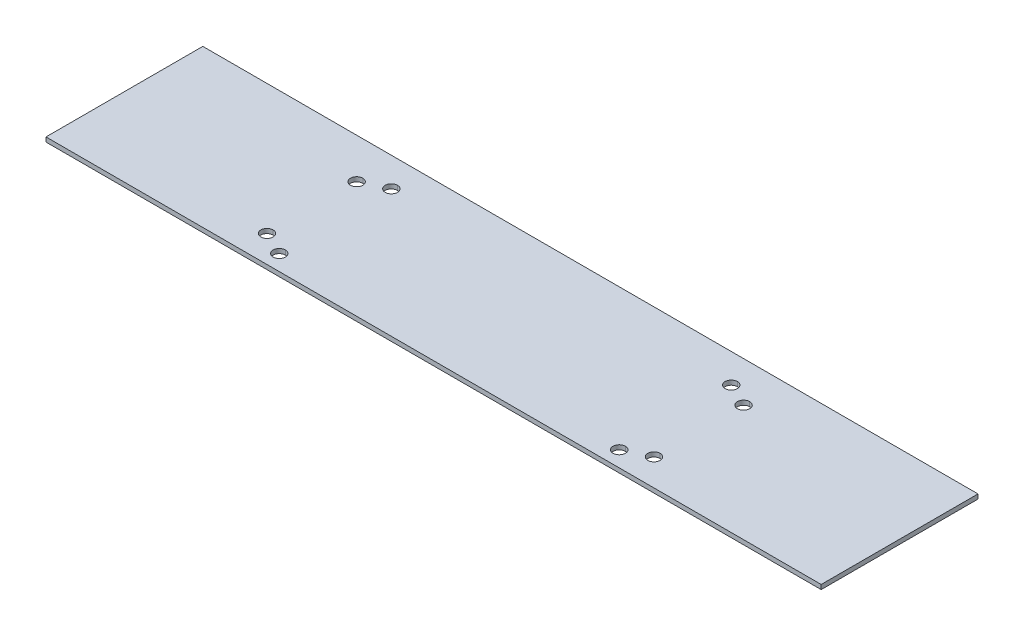
ISO-10303-21;
HEADER;
FILE_DESCRIPTION(('STEP AP214'),'2;1');
FILE_NAME('part.step','',(''),(''),'','','');
FILE_SCHEMA(('AUTOMOTIVE_DESIGN { 1 0 10303 214 1 1 1 1 }'));
ENDSEC;
DATA;
#1=APPLICATION_CONTEXT('core data for automotive mechanical design processes');
#2=APPLICATION_PROTOCOL_DEFINITION('international standard','automotive_design',2000,#1);
#3=PRODUCT_CONTEXT('',#1,'mechanical');
#4=PRODUCT('Part','Part','',(#3));
#5=PRODUCT_RELATED_PRODUCT_CATEGORY('part','',(#4));
#6=PRODUCT_DEFINITION_FORMATION('','',#4);
#7=PRODUCT_DEFINITION_CONTEXT('part definition',#1,'design');
#8=PRODUCT_DEFINITION('design','',#6,#7);
#9=PRODUCT_DEFINITION_SHAPE('','',#8);
#10=(LENGTH_UNIT() NAMED_UNIT(*) SI_UNIT(.MILLI.,.METRE.));
#11=(NAMED_UNIT(*) PLANE_ANGLE_UNIT() SI_UNIT($,.RADIAN.));
#12=(NAMED_UNIT(*) SI_UNIT($,.STERADIAN.) SOLID_ANGLE_UNIT());
#13=UNCERTAINTY_MEASURE_WITH_UNIT(LENGTH_MEASURE(1.E-05),#10,'distance_accuracy_value','');
#14=(GEOMETRIC_REPRESENTATION_CONTEXT(3) GLOBAL_UNCERTAINTY_ASSIGNED_CONTEXT((#13)) GLOBAL_UNIT_ASSIGNED_CONTEXT((#10,
#11,#12)) REPRESENTATION_CONTEXT('',''));
#15=CARTESIAN_POINT('',(0.,0.,0.));
#16=DIRECTION('',(0.,0.,1.));
#17=DIRECTION('',(1.,0.,0.));
#18=AXIS2_PLACEMENT_3D('',#15,#16,#17);
#19=CARTESIAN_POINT('',(-86.36,1.00000000000001,18.));
#20=DIRECTION('',(0.,1.,0.));
#21=DIRECTION('',(0.,0.,1.));
#22=AXIS2_PLACEMENT_3D('',#19,#20,#21);
#23=CYLINDRICAL_SURFACE('',#22,2.75);
#24=CARTESIAN_POINT('',(-86.36,-1.00000000000003,18.));
#25=DIRECTION('',(0.,1.,0.));
#26=DIRECTION('',(0.,0.,1.));
#27=AXIS2_PLACEMENT_3D('',#24,#25,#26);
#28=CIRCLE('',#27,2.75);
#29=CARTESIAN_POINT('',(-86.36,-1.00000000000003,15.25));
#30=VERTEX_POINT('',#29);
#31=CARTESIAN_POINT('',(-86.36,-1.00000000000003,20.75));
#32=VERTEX_POINT('',#31);
#33=EDGE_CURVE('E41',#30,#32,#28,.T.);
#34=ORIENTED_EDGE('',*,*,#33,.F.);
#35=DIRECTION('',(0.,1.,0.));
#36=VECTOR('',#35,1.);
#37=CARTESIAN_POINT('',(-86.36,1.00000000000001,15.25));
#38=LINE('',#37,#36);
#39=CARTESIAN_POINT('',(-86.36,1.00000000000001,15.25));
#40=VERTEX_POINT('',#39);
#41=EDGE_CURVE('E11',#30,#40,#38,.T.);
#42=ORIENTED_EDGE('',*,*,#41,.T.);
#43=CARTESIAN_POINT('',(-86.36,1.00000000000001,18.));
#44=DIRECTION('',(0.,1.,0.));
#45=DIRECTION('',(0.,0.,1.));
#46=AXIS2_PLACEMENT_3D('',#43,#44,#45);
#47=CIRCLE('',#46,2.75);
#48=CARTESIAN_POINT('',(-86.36,1.00000000000001,20.75));
#49=VERTEX_POINT('',#48);
#50=EDGE_CURVE('E27',#40,#49,#47,.T.);
#51=ORIENTED_EDGE('',*,*,#50,.T.);
#52=DIRECTION('',(0.,1.,0.));
#53=VECTOR('',#52,1.);
#54=CARTESIAN_POINT('',(-86.36,1.00000000000001,20.75));
#55=LINE('',#54,#53);
#56=EDGE_CURVE('E215',#32,#49,#55,.T.);
#57=ORIENTED_EDGE('',*,*,#56,.F.);
#58=EDGE_LOOP('',(#34,#42,#51,#57));
#59=FACE_BOUND('',#58,.T.);
#60=ADVANCED_FACE('F16',(#59),#23,.F.);
#61=CARTESIAN_POINT('',(-75.86,1.00000000000001,13.));
#62=DIRECTION('',(0.,1.,0.));
#63=DIRECTION('',(0.,0.,1.));
#64=AXIS2_PLACEMENT_3D('',#61,#62,#63);
#65=CYLINDRICAL_SURFACE('',#64,2.75);
#66=CARTESIAN_POINT('',(-75.86,-1.00000000000003,13.));
#67=DIRECTION('',(0.,1.,0.));
#68=DIRECTION('',(0.,0.,1.));
#69=AXIS2_PLACEMENT_3D('',#66,#67,#68);
#70=CIRCLE('',#69,2.75);
#71=CARTESIAN_POINT('',(-75.86,-1.00000000000003,10.25));
#72=VERTEX_POINT('',#71);
#73=CARTESIAN_POINT('',(-75.86,-1.00000000000003,15.75));
#74=VERTEX_POINT('',#73);
#75=EDGE_CURVE('E264',#72,#74,#70,.T.);
#76=ORIENTED_EDGE('',*,*,#75,.F.);
#77=DIRECTION('',(0.,1.,0.));
#78=VECTOR('',#77,1.);
#79=CARTESIAN_POINT('',(-75.86,1.00000000000001,10.25));
#80=LINE('',#79,#78);
#81=CARTESIAN_POINT('',(-75.86,1.00000000000001,10.25));
#82=VERTEX_POINT('',#81);
#83=EDGE_CURVE('E288',#72,#82,#80,.T.);
#84=ORIENTED_EDGE('',*,*,#83,.T.);
#85=CARTESIAN_POINT('',(-75.86,1.00000000000001,13.));
#86=DIRECTION('',(0.,1.,0.));
#87=DIRECTION('',(0.,0.,1.));
#88=AXIS2_PLACEMENT_3D('',#85,#86,#87);
#89=CIRCLE('',#88,2.75);
#90=CARTESIAN_POINT('',(-75.86,1.00000000000001,15.75));
#91=VERTEX_POINT('',#90);
#92=EDGE_CURVE('E292',#82,#91,#89,.T.);
#93=ORIENTED_EDGE('',*,*,#92,.T.);
#94=DIRECTION('',(0.,1.,0.));
#95=VECTOR('',#94,1.);
#96=CARTESIAN_POINT('',(-75.86,1.00000000000001,15.75));
#97=LINE('',#96,#95);
#98=EDGE_CURVE('E265',#74,#91,#97,.T.);
#99=ORIENTED_EDGE('',*,*,#98,.F.);
#100=EDGE_LOOP('',(#76,#84,#93,#99));
#101=FACE_BOUND('',#100,.T.);
#102=ADVANCED_FACE('F700',(#101),#65,.F.);
#103=CARTESIAN_POINT('',(-86.36,1.00000000000001,58.));
#104=DIRECTION('',(0.,1.,0.));
#105=DIRECTION('',(0.,0.,1.));
#106=AXIS2_PLACEMENT_3D('',#103,#104,#105);
#107=CYLINDRICAL_SURFACE('',#106,2.75);
#108=CARTESIAN_POINT('',(-86.36,-1.00000000000003,58.));
#109=DIRECTION('',(0.,1.,0.));
#110=DIRECTION('',(0.,0.,1.));
#111=AXIS2_PLACEMENT_3D('',#108,#109,#110);
#112=CIRCLE('',#111,2.75);
#113=CARTESIAN_POINT('',(-86.36,-1.00000000000003,55.25));
#114=VERTEX_POINT('',#113);
#115=CARTESIAN_POINT('',(-86.36,-1.00000000000003,60.75));
#116=VERTEX_POINT('',#115);
#117=EDGE_CURVE('E272',#114,#116,#112,.T.);
#118=ORIENTED_EDGE('',*,*,#117,.F.);
#119=DIRECTION('',(0.,1.,0.));
#120=VECTOR('',#119,1.);
#121=CARTESIAN_POINT('',(-86.36,1.00000000000001,55.25));
#122=LINE('',#121,#120);
#123=CARTESIAN_POINT('',(-86.36,1.00000000000001,55.25));
#124=VERTEX_POINT('',#123);
#125=EDGE_CURVE('E293',#114,#124,#122,.T.);
#126=ORIENTED_EDGE('',*,*,#125,.T.);
#127=CARTESIAN_POINT('',(-86.36,1.00000000000001,58.));
#128=DIRECTION('',(0.,1.,0.));
#129=DIRECTION('',(0.,0.,1.));
#130=AXIS2_PLACEMENT_3D('',#127,#128,#129);
#131=CIRCLE('',#130,2.75);
#132=CARTESIAN_POINT('',(-86.36,1.00000000000001,60.75));
#133=VERTEX_POINT('',#132);
#134=EDGE_CURVE('E282',#124,#133,#131,.T.);
#135=ORIENTED_EDGE('',*,*,#134,.T.);
#136=DIRECTION('',(0.,1.,0.));
#137=VECTOR('',#136,1.);
#138=CARTESIAN_POINT('',(-86.36,1.00000000000001,60.75));
#139=LINE('',#138,#137);
#140=EDGE_CURVE('E308',#116,#133,#139,.T.);
#141=ORIENTED_EDGE('',*,*,#140,.F.);
#142=EDGE_LOOP('',(#118,#126,#135,#141));
#143=FACE_BOUND('',#142,.T.);
#144=ADVANCED_FACE('F695',(#143),#107,.F.);
#145=CARTESIAN_POINT('',(-75.86,1.00000000000001,63.));
#146=DIRECTION('',(0.,1.,0.));
#147=DIRECTION('',(0.,0.,1.));
#148=AXIS2_PLACEMENT_3D('',#145,#146,#147);
#149=CYLINDRICAL_SURFACE('',#148,2.75);
#150=CARTESIAN_POINT('',(-75.86,-1.00000000000003,63.));
#151=DIRECTION('',(0.,1.,0.));
#152=DIRECTION('',(0.,0.,1.));
#153=AXIS2_PLACEMENT_3D('',#150,#151,#152);
#154=CIRCLE('',#153,2.75);
#155=CARTESIAN_POINT('',(-75.86,-1.00000000000003,60.25));
#156=VERTEX_POINT('',#155);
#157=CARTESIAN_POINT('',(-75.86,-1.00000000000003,65.75));
#158=VERTEX_POINT('',#157);
#159=EDGE_CURVE('E255',#156,#158,#154,.T.);
#160=ORIENTED_EDGE('',*,*,#159,.F.);
#161=DIRECTION('',(0.,1.,0.));
#162=VECTOR('',#161,1.);
#163=CARTESIAN_POINT('',(-75.86,1.00000000000001,60.25));
#164=LINE('',#163,#162);
#165=CARTESIAN_POINT('',(-75.86,1.00000000000001,60.25));
#166=VERTEX_POINT('',#165);
#167=EDGE_CURVE('E276',#156,#166,#164,.T.);
#168=ORIENTED_EDGE('',*,*,#167,.T.);
#169=CARTESIAN_POINT('',(-75.86,1.00000000000001,63.));
#170=DIRECTION('',(0.,1.,0.));
#171=DIRECTION('',(0.,0.,1.));
#172=AXIS2_PLACEMENT_3D('',#169,#170,#171);
#173=CIRCLE('',#172,2.75);
#174=CARTESIAN_POINT('',(-75.86,1.00000000000001,65.75));
#175=VERTEX_POINT('',#174);
#176=EDGE_CURVE('E273',#166,#175,#173,.T.);
#177=ORIENTED_EDGE('',*,*,#176,.T.);
#178=DIRECTION('',(0.,1.,0.));
#179=VECTOR('',#178,1.);
#180=CARTESIAN_POINT('',(-75.86,1.00000000000001,65.75));
#181=LINE('',#180,#179);
#182=EDGE_CURVE('E244',#158,#175,#181,.T.);
#183=ORIENTED_EDGE('',*,*,#182,.F.);
#184=EDGE_LOOP('',(#160,#168,#177,#183));
#185=FACE_BOUND('',#184,.T.);
#186=ADVANCED_FACE('F699',(#185),#149,.F.);
#187=CARTESIAN_POINT('',(86.36,1.00000000000001,18.));
#188=DIRECTION('',(0.,1.,0.));
#189=DIRECTION('',(0.,0.,1.));
#190=AXIS2_PLACEMENT_3D('',#187,#188,#189);
#191=CYLINDRICAL_SURFACE('',#190,2.75);
#192=CARTESIAN_POINT('',(86.36,-1.00000000000003,18.));
#193=DIRECTION('',(0.,1.,0.));
#194=DIRECTION('',(0.,0.,1.));
#195=AXIS2_PLACEMENT_3D('',#192,#193,#194);
#196=CIRCLE('',#195,2.75);
#197=CARTESIAN_POINT('',(86.36,-1.00000000000003,15.25));
#198=VERTEX_POINT('',#197);
#199=CARTESIAN_POINT('',(86.36,-1.00000000000003,20.75));
#200=VERTEX_POINT('',#199);
#201=EDGE_CURVE('E230',#198,#200,#196,.T.);
#202=ORIENTED_EDGE('',*,*,#201,.F.);
#203=DIRECTION('',(0.,1.,0.));
#204=VECTOR('',#203,1.);
#205=CARTESIAN_POINT('',(86.36,1.00000000000001,15.25));
#206=LINE('',#205,#204);
#207=CARTESIAN_POINT('',(86.36,1.00000000000001,15.25));
#208=VERTEX_POINT('',#207);
#209=EDGE_CURVE('E277',#198,#208,#206,.T.);
#210=ORIENTED_EDGE('',*,*,#209,.T.);
#211=CARTESIAN_POINT('',(86.36,1.00000000000001,18.));
#212=DIRECTION('',(0.,1.,0.));
#213=DIRECTION('',(0.,0.,1.));
#214=AXIS2_PLACEMENT_3D('',#211,#212,#213);
#215=CIRCLE('',#214,2.75);
#216=CARTESIAN_POINT('',(86.36,1.00000000000001,20.75));
#217=VERTEX_POINT('',#216);
#218=EDGE_CURVE('E195',#208,#217,#215,.T.);
#219=ORIENTED_EDGE('',*,*,#218,.T.);
#220=DIRECTION('',(0.,1.,0.));
#221=VECTOR('',#220,1.);
#222=CARTESIAN_POINT('',(86.36,1.00000000000001,20.75));
#223=LINE('',#222,#221);
#224=EDGE_CURVE('E200',#200,#217,#223,.T.);
#225=ORIENTED_EDGE('',*,*,#224,.F.);
#226=EDGE_LOOP('',(#202,#210,#219,#225));
#227=FACE_BOUND('',#226,.T.);
#228=ADVANCED_FACE('F709',(#227),#191,.F.);
#229=CARTESIAN_POINT('',(75.86,1.00000000000001,13.));
#230=DIRECTION('',(0.,1.,0.));
#231=DIRECTION('',(0.,0.,1.));
#232=AXIS2_PLACEMENT_3D('',#229,#230,#231);
#233=CYLINDRICAL_SURFACE('',#232,2.75);
#234=CARTESIAN_POINT('',(75.86,-1.00000000000003,13.));
#235=DIRECTION('',(0.,1.,0.));
#236=DIRECTION('',(0.,0.,1.));
#237=AXIS2_PLACEMENT_3D('',#234,#235,#236);
#238=CIRCLE('',#237,2.75);
#239=CARTESIAN_POINT('',(75.86,-1.00000000000003,10.25));
#240=VERTEX_POINT('',#239);
#241=CARTESIAN_POINT('',(75.86,-1.00000000000003,15.75));
#242=VERTEX_POINT('',#241);
#243=EDGE_CURVE('E190',#240,#242,#238,.T.);
#244=ORIENTED_EDGE('',*,*,#243,.F.);
#245=DIRECTION('',(0.,1.,0.));
#246=VECTOR('',#245,1.);
#247=CARTESIAN_POINT('',(75.86,1.00000000000001,10.25));
#248=LINE('',#247,#246);
#249=CARTESIAN_POINT('',(75.86,1.00000000000001,10.25));
#250=VERTEX_POINT('',#249);
#251=EDGE_CURVE('E184',#240,#250,#248,.T.);
#252=ORIENTED_EDGE('',*,*,#251,.T.);
#253=CARTESIAN_POINT('',(75.86,1.00000000000001,13.));
#254=DIRECTION('',(0.,1.,0.));
#255=DIRECTION('',(0.,0.,1.));
#256=AXIS2_PLACEMENT_3D('',#253,#254,#255);
#257=CIRCLE('',#256,2.75);
#258=CARTESIAN_POINT('',(75.86,1.00000000000001,15.75));
#259=VERTEX_POINT('',#258);
#260=EDGE_CURVE('E176',#250,#259,#257,.T.);
#261=ORIENTED_EDGE('',*,*,#260,.T.);
#262=DIRECTION('',(0.,1.,0.));
#263=VECTOR('',#262,1.);
#264=CARTESIAN_POINT('',(75.86,1.00000000000001,15.75));
#265=LINE('',#264,#263);
#266=EDGE_CURVE('E198',#242,#259,#265,.T.);
#267=ORIENTED_EDGE('',*,*,#266,.F.);
#268=EDGE_LOOP('',(#244,#252,#261,#267));
#269=FACE_BOUND('',#268,.T.);
#270=ADVANCED_FACE('F188',(#269),#233,.F.);
#271=CARTESIAN_POINT('',(86.36,1.00000000000001,58.));
#272=DIRECTION('',(0.,1.,0.));
#273=DIRECTION('',(0.,0.,1.));
#274=AXIS2_PLACEMENT_3D('',#271,#272,#273);
#275=CYLINDRICAL_SURFACE('',#274,2.75);
#276=CARTESIAN_POINT('',(86.36,-1.00000000000003,58.));
#277=DIRECTION('',(0.,1.,0.));
#278=DIRECTION('',(0.,0.,1.));
#279=AXIS2_PLACEMENT_3D('',#276,#277,#278);
#280=CIRCLE('',#279,2.75);
#281=CARTESIAN_POINT('',(86.36,-1.00000000000003,55.25));
#282=VERTEX_POINT('',#281);
#283=CARTESIAN_POINT('',(86.36,-1.00000000000003,60.75));
#284=VERTEX_POINT('',#283);
#285=EDGE_CURVE('E304',#282,#284,#280,.T.);
#286=ORIENTED_EDGE('',*,*,#285,.F.);
#287=DIRECTION('',(0.,1.,0.));
#288=VECTOR('',#287,1.);
#289=CARTESIAN_POINT('',(86.36,1.00000000000001,55.25));
#290=LINE('',#289,#288);
#291=CARTESIAN_POINT('',(86.36,1.00000000000001,55.25));
#292=VERTEX_POINT('',#291);
#293=EDGE_CURVE('E185',#282,#292,#290,.T.);
#294=ORIENTED_EDGE('',*,*,#293,.T.);
#295=CARTESIAN_POINT('',(86.36,1.00000000000001,58.));
#296=DIRECTION('',(0.,1.,0.));
#297=DIRECTION('',(0.,0.,1.));
#298=AXIS2_PLACEMENT_3D('',#295,#296,#297);
#299=CIRCLE('',#298,2.75);
#300=CARTESIAN_POINT('',(86.36,1.00000000000001,60.75));
#301=VERTEX_POINT('',#300);
#302=EDGE_CURVE('E345',#292,#301,#299,.T.);
#303=ORIENTED_EDGE('',*,*,#302,.T.);
#304=DIRECTION('',(0.,1.,0.));
#305=VECTOR('',#304,1.);
#306=CARTESIAN_POINT('',(86.36,1.00000000000001,60.75));
#307=LINE('',#306,#305);
#308=EDGE_CURVE('E316',#284,#301,#307,.T.);
#309=ORIENTED_EDGE('',*,*,#308,.F.);
#310=EDGE_LOOP('',(#286,#294,#303,#309));
#311=FACE_BOUND('',#310,.T.);
#312=ADVANCED_FACE('F803',(#311),#275,.F.);
#313=CARTESIAN_POINT('',(75.86,1.00000000000001,63.));
#314=DIRECTION('',(0.,1.,0.));
#315=DIRECTION('',(0.,0.,1.));
#316=AXIS2_PLACEMENT_3D('',#313,#314,#315);
#317=CYLINDRICAL_SURFACE('',#316,2.75);
#318=CARTESIAN_POINT('',(75.86,-1.00000000000003,63.));
#319=DIRECTION('',(0.,1.,0.));
#320=DIRECTION('',(0.,0.,1.));
#321=AXIS2_PLACEMENT_3D('',#318,#319,#320);
#322=CIRCLE('',#321,2.75);
#323=CARTESIAN_POINT('',(75.86,-1.00000000000003,60.25));
#324=VERTEX_POINT('',#323);
#325=CARTESIAN_POINT('',(75.86,-1.00000000000003,65.75));
#326=VERTEX_POINT('',#325);
#327=EDGE_CURVE('E332',#324,#326,#322,.T.);
#328=ORIENTED_EDGE('',*,*,#327,.F.);
#329=DIRECTION('',(0.,1.,0.));
#330=VECTOR('',#329,1.);
#331=CARTESIAN_POINT('',(75.86,1.00000000000001,60.25));
#332=LINE('',#331,#330);
#333=CARTESIAN_POINT('',(75.86,1.00000000000001,60.25));
#334=VERTEX_POINT('',#333);
#335=EDGE_CURVE('E336',#324,#334,#332,.T.);
#336=ORIENTED_EDGE('',*,*,#335,.T.);
#337=CARTESIAN_POINT('',(75.86,1.00000000000001,63.));
#338=DIRECTION('',(0.,1.,0.));
#339=DIRECTION('',(0.,0.,1.));
#340=AXIS2_PLACEMENT_3D('',#337,#338,#339);
#341=CIRCLE('',#340,2.75);
#342=CARTESIAN_POINT('',(75.86,1.00000000000001,65.75));
#343=VERTEX_POINT('',#342);
#344=EDGE_CURVE('E333',#334,#343,#341,.T.);
#345=ORIENTED_EDGE('',*,*,#344,.T.);
#346=DIRECTION('',(0.,1.,0.));
#347=VECTOR('',#346,1.);
#348=CARTESIAN_POINT('',(75.86,1.00000000000001,65.75));
#349=LINE('',#348,#347);
#350=EDGE_CURVE('E224',#326,#343,#349,.T.);
#351=ORIENTED_EDGE('',*,*,#350,.F.);
#352=EDGE_LOOP('',(#328,#336,#345,#351));
#353=FACE_BOUND('',#352,.T.);
#354=ADVANCED_FACE('F807',(#353),#317,.F.);
#355=CARTESIAN_POINT('',(173.,1.00000000000002,70.));
#356=DIRECTION('',(0.,-1.,0.));
#357=DIRECTION('',(0.,0.,-1.));
#358=AXIS2_PLACEMENT_3D('',#355,#356,#357);
#359=PLANE('',#358);
#360=DIRECTION('',(-1.,0.,0.));
#361=VECTOR('',#360,1.);
#362=CARTESIAN_POINT('',(173.,1.00000000000002,0.));
#363=LINE('',#362,#361);
#364=CARTESIAN_POINT('',(173.,1.00000000000002,0.));
#365=VERTEX_POINT('',#364);
#366=CARTESIAN_POINT('',(-173.,0.999999999999982,0.));
#367=VERTEX_POINT('',#366);
#368=EDGE_CURVE('E228',#365,#367,#363,.T.);
#369=ORIENTED_EDGE('',*,*,#368,.T.);
#370=DIRECTION('',(0.,0.,-1.));
#371=VECTOR('',#370,1.);
#372=CARTESIAN_POINT('',(-173.,0.999999999999982,70.));
#373=LINE('',#372,#371);
#374=CARTESIAN_POINT('',(-173.,0.999999999999982,70.));
#375=VERTEX_POINT('',#374);
#376=EDGE_CURVE('E361',#375,#367,#373,.T.);
#377=ORIENTED_EDGE('',*,*,#376,.F.);
#378=DIRECTION('',(-1.,0.,0.));
#379=VECTOR('',#378,1.);
#380=CARTESIAN_POINT('',(173.,1.00000000000002,70.));
#381=LINE('',#380,#379);
#382=CARTESIAN_POINT('',(173.,1.00000000000002,70.));
#383=VERTEX_POINT('',#382);
#384=EDGE_CURVE('E220',#383,#375,#381,.T.);
#385=ORIENTED_EDGE('',*,*,#384,.F.);
#386=DIRECTION('',(0.,0.,-1.));
#387=VECTOR('',#386,1.);
#388=CARTESIAN_POINT('',(173.,1.00000000000002,70.));
#389=LINE('',#388,#387);
#390=EDGE_CURVE('E225',#383,#365,#389,.T.);
#391=ORIENTED_EDGE('',*,*,#390,.T.);
#392=EDGE_LOOP('',(#369,#377,#385,#391));
#393=FACE_BOUND('',#392,.T.);
#394=CARTESIAN_POINT('',(-86.36,1.00000000000001,18.));
#395=DIRECTION('',(0.,1.,0.));
#396=DIRECTION('',(0.,0.,1.));
#397=AXIS2_PLACEMENT_3D('',#394,#395,#396);
#398=CIRCLE('',#397,2.75);
#399=EDGE_CURVE('E219',#49,#40,#398,.T.);
#400=ORIENTED_EDGE('',*,*,#399,.F.);
#401=ORIENTED_EDGE('',*,*,#50,.F.);
#402=EDGE_LOOP('',(#400,#401));
#403=FACE_BOUND('',#402,.T.);
#404=CARTESIAN_POINT('',(-86.36,1.00000000000001,58.));
#405=DIRECTION('',(0.,1.,0.));
#406=DIRECTION('',(0.,0.,1.));
#407=AXIS2_PLACEMENT_3D('',#404,#405,#406);
#408=CIRCLE('',#407,2.75);
#409=EDGE_CURVE('E213',#133,#124,#408,.T.);
#410=ORIENTED_EDGE('',*,*,#409,.F.);
#411=ORIENTED_EDGE('',*,*,#134,.F.);
#412=EDGE_LOOP('',(#410,#411));
#413=FACE_BOUND('',#412,.T.);
#414=CARTESIAN_POINT('',(-75.86,1.00000000000001,63.));
#415=DIRECTION('',(0.,1.,0.));
#416=DIRECTION('',(0.,0.,1.));
#417=AXIS2_PLACEMENT_3D('',#414,#415,#416);
#418=CIRCLE('',#417,2.75);
#419=EDGE_CURVE('E285',#175,#166,#418,.T.);
#420=ORIENTED_EDGE('',*,*,#419,.F.);
#421=ORIENTED_EDGE('',*,*,#176,.F.);
#422=EDGE_LOOP('',(#420,#421));
#423=FACE_BOUND('',#422,.T.);
#424=CARTESIAN_POINT('',(86.36,1.00000000000001,18.));
#425=DIRECTION('',(0.,1.,0.));
#426=DIRECTION('',(0.,0.,1.));
#427=AXIS2_PLACEMENT_3D('',#424,#425,#426);
#428=CIRCLE('',#427,2.75);
#429=EDGE_CURVE('E209',#217,#208,#428,.T.);
#430=ORIENTED_EDGE('',*,*,#429,.F.);
#431=ORIENTED_EDGE('',*,*,#218,.F.);
#432=EDGE_LOOP('',(#430,#431));
#433=FACE_BOUND('',#432,.T.);
#434=CARTESIAN_POINT('',(75.86,1.00000000000001,13.));
#435=DIRECTION('',(0.,1.,0.));
#436=DIRECTION('',(0.,0.,1.));
#437=AXIS2_PLACEMENT_3D('',#434,#435,#436);
#438=CIRCLE('',#437,2.75);
#439=EDGE_CURVE('E181',#259,#250,#438,.T.);
#440=ORIENTED_EDGE('',*,*,#439,.F.);
#441=ORIENTED_EDGE('',*,*,#260,.F.);
#442=EDGE_LOOP('',(#440,#441));
#443=FACE_BOUND('',#442,.T.);
#444=CARTESIAN_POINT('',(86.36,1.00000000000001,58.));
#445=DIRECTION('',(0.,1.,0.));
#446=DIRECTION('',(0.,0.,1.));
#447=AXIS2_PLACEMENT_3D('',#444,#445,#446);
#448=CIRCLE('',#447,2.75);
#449=EDGE_CURVE('E207',#301,#292,#448,.T.);
#450=ORIENTED_EDGE('',*,*,#449,.F.);
#451=ORIENTED_EDGE('',*,*,#302,.F.);
#452=EDGE_LOOP('',(#450,#451));
#453=FACE_BOUND('',#452,.T.);
#454=CARTESIAN_POINT('',(75.86,1.00000000000001,63.));
#455=DIRECTION('',(0.,1.,0.));
#456=DIRECTION('',(0.,0.,1.));
#457=AXIS2_PLACEMENT_3D('',#454,#455,#456);
#458=CIRCLE('',#457,2.75);
#459=EDGE_CURVE('E312',#343,#334,#458,.T.);
#460=ORIENTED_EDGE('',*,*,#459,.F.);
#461=ORIENTED_EDGE('',*,*,#344,.F.);
#462=EDGE_LOOP('',(#460,#461));
#463=FACE_BOUND('',#462,.T.);
#464=CARTESIAN_POINT('',(-75.86,1.00000000000001,13.));
#465=DIRECTION('',(0.,1.,0.));
#466=DIRECTION('',(0.,0.,1.));
#467=AXIS2_PLACEMENT_3D('',#464,#465,#466);
#468=CIRCLE('',#467,2.75);
#469=EDGE_CURVE('E218',#91,#82,#468,.T.);
#470=ORIENTED_EDGE('',*,*,#469,.F.);
#471=ORIENTED_EDGE('',*,*,#92,.F.);
#472=EDGE_LOOP('',(#470,#471));
#473=FACE_BOUND('',#472,.T.);
#474=ADVANCED_FACE('F178',(#393,#403,#413,#423,#433,#443,#453,#463,#473),#359,.F.);
#475=CARTESIAN_POINT('',(-173.,-1.00000000000002,70.));
#476=DIRECTION('',(1.,0.,0.));
#477=DIRECTION('',(0.,1.,0.));
#478=AXIS2_PLACEMENT_3D('',#475,#476,#477);
#479=PLANE('',#478);
#480=DIRECTION('',(0.,-1.,0.));
#481=VECTOR('',#480,1.);
#482=CARTESIAN_POINT('',(-173.,-1.00000000000002,0.));
#483=LINE('',#482,#481);
#484=CARTESIAN_POINT('',(-173.,-1.00000000000002,0.));
#485=VERTEX_POINT('',#484);
#486=EDGE_CURVE('E229',#367,#485,#483,.T.);
#487=ORIENTED_EDGE('',*,*,#486,.T.);
#488=DIRECTION('',(0.,0.,-1.));
#489=VECTOR('',#488,1.);
#490=CARTESIAN_POINT('',(-173.,-1.00000000000002,70.));
#491=LINE('',#490,#489);
#492=CARTESIAN_POINT('',(-173.,-1.00000000000002,70.));
#493=VERTEX_POINT('',#492);
#494=EDGE_CURVE('E297',#493,#485,#491,.T.);
#495=ORIENTED_EDGE('',*,*,#494,.F.);
#496=DIRECTION('',(0.,-1.,0.));
#497=VECTOR('',#496,1.);
#498=CARTESIAN_POINT('',(-173.,-1.00000000000002,70.));
#499=LINE('',#498,#497);
#500=EDGE_CURVE('E240',#375,#493,#499,.T.);
#501=ORIENTED_EDGE('',*,*,#500,.F.);
#502=ORIENTED_EDGE('',*,*,#376,.T.);
#503=EDGE_LOOP('',(#487,#495,#501,#502));
#504=FACE_BOUND('',#503,.T.);
#505=ADVANCED_FACE('F419',(#504),#479,.F.);
#506=CARTESIAN_POINT('',(173.,-0.999999999999978,70.));
#507=DIRECTION('',(0.,1.,0.));
#508=DIRECTION('',(1.,0.,0.));
#509=AXIS2_PLACEMENT_3D('',#506,#507,#508);
#510=PLANE('',#509);
#511=DIRECTION('',(1.,0.,0.));
#512=VECTOR('',#511,1.);
#513=CARTESIAN_POINT('',(173.,-0.999999999999978,0.));
#514=LINE('',#513,#512);
#515=CARTESIAN_POINT('',(173.,-0.999999999999978,0.));
#516=VERTEX_POINT('',#515);
#517=EDGE_CURVE('E20',#485,#516,#514,.T.);
#518=ORIENTED_EDGE('',*,*,#517,.T.);
#519=DIRECTION('',(0.,0.,-1.));
#520=VECTOR('',#519,1.);
#521=CARTESIAN_POINT('',(173.,-0.999999999999978,70.));
#522=LINE('',#521,#520);
#523=CARTESIAN_POINT('',(173.,-0.999999999999978,70.));
#524=VERTEX_POINT('',#523);
#525=EDGE_CURVE('E245',#524,#516,#522,.T.);
#526=ORIENTED_EDGE('',*,*,#525,.F.);
#527=DIRECTION('',(1.,0.,0.));
#528=VECTOR('',#527,1.);
#529=CARTESIAN_POINT('',(173.,-0.999999999999978,70.));
#530=LINE('',#529,#528);
#531=EDGE_CURVE('E236',#493,#524,#530,.T.);
#532=ORIENTED_EDGE('',*,*,#531,.F.);
#533=ORIENTED_EDGE('',*,*,#494,.T.);
#534=EDGE_LOOP('',(#518,#526,#532,#533));
#535=FACE_BOUND('',#534,.T.);
#536=CARTESIAN_POINT('',(-86.36,-1.00000000000003,18.));
#537=DIRECTION('',(0.,1.,0.));
#538=DIRECTION('',(0.,0.,1.));
#539=AXIS2_PLACEMENT_3D('',#536,#537,#538);
#540=CIRCLE('',#539,2.75);
#541=EDGE_CURVE('E300',#32,#30,#540,.T.);
#542=ORIENTED_EDGE('',*,*,#541,.T.);
#543=ORIENTED_EDGE('',*,*,#33,.T.);
#544=EDGE_LOOP('',(#542,#543));
#545=FACE_BOUND('',#544,.T.);
#546=CARTESIAN_POINT('',(-75.86,-1.00000000000003,13.));
#547=DIRECTION('',(0.,1.,0.));
#548=DIRECTION('',(0.,0.,1.));
#549=AXIS2_PLACEMENT_3D('',#546,#547,#548);
#550=CIRCLE('',#549,2.75);
#551=EDGE_CURVE('E260',#74,#72,#550,.T.);
#552=ORIENTED_EDGE('',*,*,#551,.T.);
#553=ORIENTED_EDGE('',*,*,#75,.T.);
#554=EDGE_LOOP('',(#552,#553));
#555=FACE_BOUND('',#554,.T.);
#556=CARTESIAN_POINT('',(-86.36,-1.00000000000003,58.));
#557=DIRECTION('',(0.,1.,0.));
#558=DIRECTION('',(0.,0.,1.));
#559=AXIS2_PLACEMENT_3D('',#556,#557,#558);
#560=CIRCLE('',#559,2.75);
#561=EDGE_CURVE('E268',#116,#114,#560,.T.);
#562=ORIENTED_EDGE('',*,*,#561,.T.);
#563=ORIENTED_EDGE('',*,*,#117,.T.);
#564=EDGE_LOOP('',(#562,#563));
#565=FACE_BOUND('',#564,.T.);
#566=CARTESIAN_POINT('',(-75.86,-1.00000000000003,63.));
#567=DIRECTION('',(0.,1.,0.));
#568=DIRECTION('',(0.,0.,1.));
#569=AXIS2_PLACEMENT_3D('',#566,#567,#568);
#570=CIRCLE('',#569,2.75);
#571=EDGE_CURVE('E259',#158,#156,#570,.T.);
#572=ORIENTED_EDGE('',*,*,#571,.T.);
#573=ORIENTED_EDGE('',*,*,#159,.T.);
#574=EDGE_LOOP('',(#572,#573));
#575=FACE_BOUND('',#574,.T.);
#576=CARTESIAN_POINT('',(86.36,-1.00000000000003,18.));
#577=DIRECTION('',(0.,1.,0.));
#578=DIRECTION('',(0.,0.,1.));
#579=AXIS2_PLACEMENT_3D('',#576,#577,#578);
#580=CIRCLE('',#579,2.75);
#581=EDGE_CURVE('E234',#200,#198,#580,.T.);
#582=ORIENTED_EDGE('',*,*,#581,.T.);
#583=ORIENTED_EDGE('',*,*,#201,.T.);
#584=EDGE_LOOP('',(#582,#583));
#585=FACE_BOUND('',#584,.T.);
#586=CARTESIAN_POINT('',(75.86,-1.00000000000003,13.));
#587=DIRECTION('',(0.,1.,0.));
#588=DIRECTION('',(0.,0.,1.));
#589=AXIS2_PLACEMENT_3D('',#586,#587,#588);
#590=CIRCLE('',#589,2.75);
#591=EDGE_CURVE('E235',#242,#240,#590,.T.);
#592=ORIENTED_EDGE('',*,*,#591,.T.);
#593=ORIENTED_EDGE('',*,*,#243,.T.);
#594=EDGE_LOOP('',(#592,#593));
#595=FACE_BOUND('',#594,.T.);
#596=CARTESIAN_POINT('',(86.36,-1.00000000000003,58.));
#597=DIRECTION('',(0.,1.,0.));
#598=DIRECTION('',(0.,0.,1.));
#599=AXIS2_PLACEMENT_3D('',#596,#597,#598);
#600=CIRCLE('',#599,2.75);
#601=EDGE_CURVE('E251',#284,#282,#600,.T.);
#602=ORIENTED_EDGE('',*,*,#601,.T.);
#603=ORIENTED_EDGE('',*,*,#285,.T.);
#604=EDGE_LOOP('',(#602,#603));
#605=FACE_BOUND('',#604,.T.);
#606=CARTESIAN_POINT('',(75.86,-1.00000000000003,63.));
#607=DIRECTION('',(0.,1.,0.));
#608=DIRECTION('',(0.,0.,1.));
#609=AXIS2_PLACEMENT_3D('',#606,#607,#608);
#610=CIRCLE('',#609,2.75);
#611=EDGE_CURVE('E329',#326,#324,#610,.T.);
#612=ORIENTED_EDGE('',*,*,#611,.T.);
#613=ORIENTED_EDGE('',*,*,#327,.T.);
#614=EDGE_LOOP('',(#612,#613));
#615=FACE_BOUND('',#614,.T.);
#616=ADVANCED_FACE('F423',(#535,#545,#555,#565,#575,#585,#595,#605,#615),#510,.F.);
#617=CARTESIAN_POINT('',(173.,-0.999999999999978,70.));
#618=DIRECTION('',(-1.,0.,0.));
#619=DIRECTION('',(0.,0.,1.));
#620=AXIS2_PLACEMENT_3D('',#617,#618,#619);
#621=PLANE('',#620);
#622=DIRECTION('',(0.,1.,0.));
#623=VECTOR('',#622,1.);
#624=CARTESIAN_POINT('',(173.,-0.999999999999978,0.));
#625=LINE('',#624,#623);
#626=EDGE_CURVE('E248',#516,#365,#625,.T.);
#627=ORIENTED_EDGE('',*,*,#626,.T.);
#628=ORIENTED_EDGE('',*,*,#390,.F.);
#629=DIRECTION('',(0.,1.,0.));
#630=VECTOR('',#629,1.);
#631=CARTESIAN_POINT('',(173.,-0.999999999999978,70.));
#632=LINE('',#631,#630);
#633=EDGE_CURVE('E223',#524,#383,#632,.T.);
#634=ORIENTED_EDGE('',*,*,#633,.F.);
#635=ORIENTED_EDGE('',*,*,#525,.T.);
#636=EDGE_LOOP('',(#627,#628,#634,#635));
#637=FACE_BOUND('',#636,.T.);
#638=ADVANCED_FACE('F431',(#637),#621,.F.);
#639=CARTESIAN_POINT('',(0.,0.,70.));
#640=DIRECTION('',(0.,0.,1.));
#641=DIRECTION('',(1.,0.,0.));
#642=AXIS2_PLACEMENT_3D('',#639,#640,#641);
#643=PLANE('',#642);
#644=ORIENTED_EDGE('',*,*,#500,.T.);
#645=ORIENTED_EDGE('',*,*,#531,.T.);
#646=ORIENTED_EDGE('',*,*,#633,.T.);
#647=ORIENTED_EDGE('',*,*,#384,.T.);
#648=EDGE_LOOP('',(#644,#645,#646,#647));
#649=FACE_BOUND('',#648,.T.);
#650=ADVANCED_FACE('F415',(#649),#643,.T.);
#651=CARTESIAN_POINT('',(0.,0.,0.));
#652=DIRECTION('',(0.,0.,1.));
#653=DIRECTION('',(1.,0.,0.));
#654=AXIS2_PLACEMENT_3D('',#651,#652,#653);
#655=PLANE('',#654);
#656=ORIENTED_EDGE('',*,*,#486,.F.);
#657=ORIENTED_EDGE('',*,*,#368,.F.);
#658=ORIENTED_EDGE('',*,*,#626,.F.);
#659=ORIENTED_EDGE('',*,*,#517,.F.);
#660=EDGE_LOOP('',(#656,#657,#658,#659));
#661=FACE_BOUND('',#660,.T.);
#662=ADVANCED_FACE('F434',(#661),#655,.F.);
#663=CARTESIAN_POINT('',(75.86,1.00000000000001,63.));
#664=DIRECTION('',(0.,1.,0.));
#665=DIRECTION('',(0.,0.,1.));
#666=AXIS2_PLACEMENT_3D('',#663,#664,#665);
#667=CYLINDRICAL_SURFACE('',#666,2.75);
#668=ORIENTED_EDGE('',*,*,#335,.F.);
#669=ORIENTED_EDGE('',*,*,#611,.F.);
#670=ORIENTED_EDGE('',*,*,#350,.T.);
#671=ORIENTED_EDGE('',*,*,#459,.T.);
#672=EDGE_LOOP('',(#668,#669,#670,#671));
#673=FACE_BOUND('',#672,.T.);
#674=ADVANCED_FACE('F790',(#673),#667,.F.);
#675=CARTESIAN_POINT('',(86.36,1.00000000000001,58.));
#676=DIRECTION('',(0.,1.,0.));
#677=DIRECTION('',(0.,0.,1.));
#678=AXIS2_PLACEMENT_3D('',#675,#676,#677);
#679=CYLINDRICAL_SURFACE('',#678,2.75);
#680=ORIENTED_EDGE('',*,*,#293,.F.);
#681=ORIENTED_EDGE('',*,*,#601,.F.);
#682=ORIENTED_EDGE('',*,*,#308,.T.);
#683=ORIENTED_EDGE('',*,*,#449,.T.);
#684=EDGE_LOOP('',(#680,#681,#682,#683));
#685=FACE_BOUND('',#684,.T.);
#686=ADVANCED_FACE('F747',(#685),#679,.F.);
#687=CARTESIAN_POINT('',(75.86,1.00000000000001,13.));
#688=DIRECTION('',(0.,1.,0.));
#689=DIRECTION('',(0.,0.,1.));
#690=AXIS2_PLACEMENT_3D('',#687,#688,#689);
#691=CYLINDRICAL_SURFACE('',#690,2.75);
#692=ORIENTED_EDGE('',*,*,#251,.F.);
#693=ORIENTED_EDGE('',*,*,#591,.F.);
#694=ORIENTED_EDGE('',*,*,#266,.T.);
#695=ORIENTED_EDGE('',*,*,#439,.T.);
#696=EDGE_LOOP('',(#692,#693,#694,#695));
#697=FACE_BOUND('',#696,.T.);
#698=ADVANCED_FACE('F197',(#697),#691,.F.);
#699=CARTESIAN_POINT('',(86.36,1.00000000000001,18.));
#700=DIRECTION('',(0.,1.,0.));
#701=DIRECTION('',(0.,0.,1.));
#702=AXIS2_PLACEMENT_3D('',#699,#700,#701);
#703=CYLINDRICAL_SURFACE('',#702,2.75);
#704=ORIENTED_EDGE('',*,*,#209,.F.);
#705=ORIENTED_EDGE('',*,*,#581,.F.);
#706=ORIENTED_EDGE('',*,*,#224,.T.);
#707=ORIENTED_EDGE('',*,*,#429,.T.);
#708=EDGE_LOOP('',(#704,#705,#706,#707));
#709=FACE_BOUND('',#708,.T.);
#710=ADVANCED_FACE('F746',(#709),#703,.F.);
#711=CARTESIAN_POINT('',(-75.86,1.00000000000001,63.));
#712=DIRECTION('',(0.,1.,0.));
#713=DIRECTION('',(0.,0.,1.));
#714=AXIS2_PLACEMENT_3D('',#711,#712,#713);
#715=CYLINDRICAL_SURFACE('',#714,2.75);
#716=ORIENTED_EDGE('',*,*,#167,.F.);
#717=ORIENTED_EDGE('',*,*,#571,.F.);
#718=ORIENTED_EDGE('',*,*,#182,.T.);
#719=ORIENTED_EDGE('',*,*,#419,.T.);
#720=EDGE_LOOP('',(#716,#717,#718,#719));
#721=FACE_BOUND('',#720,.T.);
#722=ADVANCED_FACE('F755',(#721),#715,.F.);
#723=CARTESIAN_POINT('',(-86.36,1.00000000000001,58.));
#724=DIRECTION('',(0.,1.,0.));
#725=DIRECTION('',(0.,0.,1.));
#726=AXIS2_PLACEMENT_3D('',#723,#724,#725);
#727=CYLINDRICAL_SURFACE('',#726,2.75);
#728=ORIENTED_EDGE('',*,*,#125,.F.);
#729=ORIENTED_EDGE('',*,*,#561,.F.);
#730=ORIENTED_EDGE('',*,*,#140,.T.);
#731=ORIENTED_EDGE('',*,*,#409,.T.);
#732=EDGE_LOOP('',(#728,#729,#730,#731));
#733=FACE_BOUND('',#732,.T.);
#734=ADVANCED_FACE('F761',(#733),#727,.F.);
#735=CARTESIAN_POINT('',(-75.86,1.00000000000001,13.));
#736=DIRECTION('',(0.,1.,0.));
#737=DIRECTION('',(0.,0.,1.));
#738=AXIS2_PLACEMENT_3D('',#735,#736,#737);
#739=CYLINDRICAL_SURFACE('',#738,2.75);
#740=ORIENTED_EDGE('',*,*,#83,.F.);
#741=ORIENTED_EDGE('',*,*,#551,.F.);
#742=ORIENTED_EDGE('',*,*,#98,.T.);
#743=ORIENTED_EDGE('',*,*,#469,.T.);
#744=EDGE_LOOP('',(#740,#741,#742,#743));
#745=FACE_BOUND('',#744,.T.);
#746=ADVANCED_FACE('F765',(#745),#739,.F.);
#747=CARTESIAN_POINT('',(-86.36,1.00000000000001,18.));
#748=DIRECTION('',(0.,1.,0.));
#749=DIRECTION('',(0.,0.,1.));
#750=AXIS2_PLACEMENT_3D('',#747,#748,#749);
#751=CYLINDRICAL_SURFACE('',#750,2.75);
#752=ORIENTED_EDGE('',*,*,#41,.F.);
#753=ORIENTED_EDGE('',*,*,#541,.F.);
#754=ORIENTED_EDGE('',*,*,#56,.T.);
#755=ORIENTED_EDGE('',*,*,#399,.T.);
#756=EDGE_LOOP('',(#752,#753,#754,#755));
#757=FACE_BOUND('',#756,.T.);
#758=ADVANCED_FACE('F18',(#757),#751,.F.);
#759=CLOSED_SHELL('',(#60,#102,#144,#186,#228,#270,#312,#354,#474,#505,#616,#638,#650,#662,#674,
#686,#698,#710,#722,#734,#746,#758));
#760=MANIFOLD_SOLID_BREP('B1',#759);
#761=ADVANCED_BREP_SHAPE_REPRESENTATION('',(#18,#760),#14);
#762=SHAPE_DEFINITION_REPRESENTATION(#9,#761);
ENDSEC;
END-ISO-10303-21;
